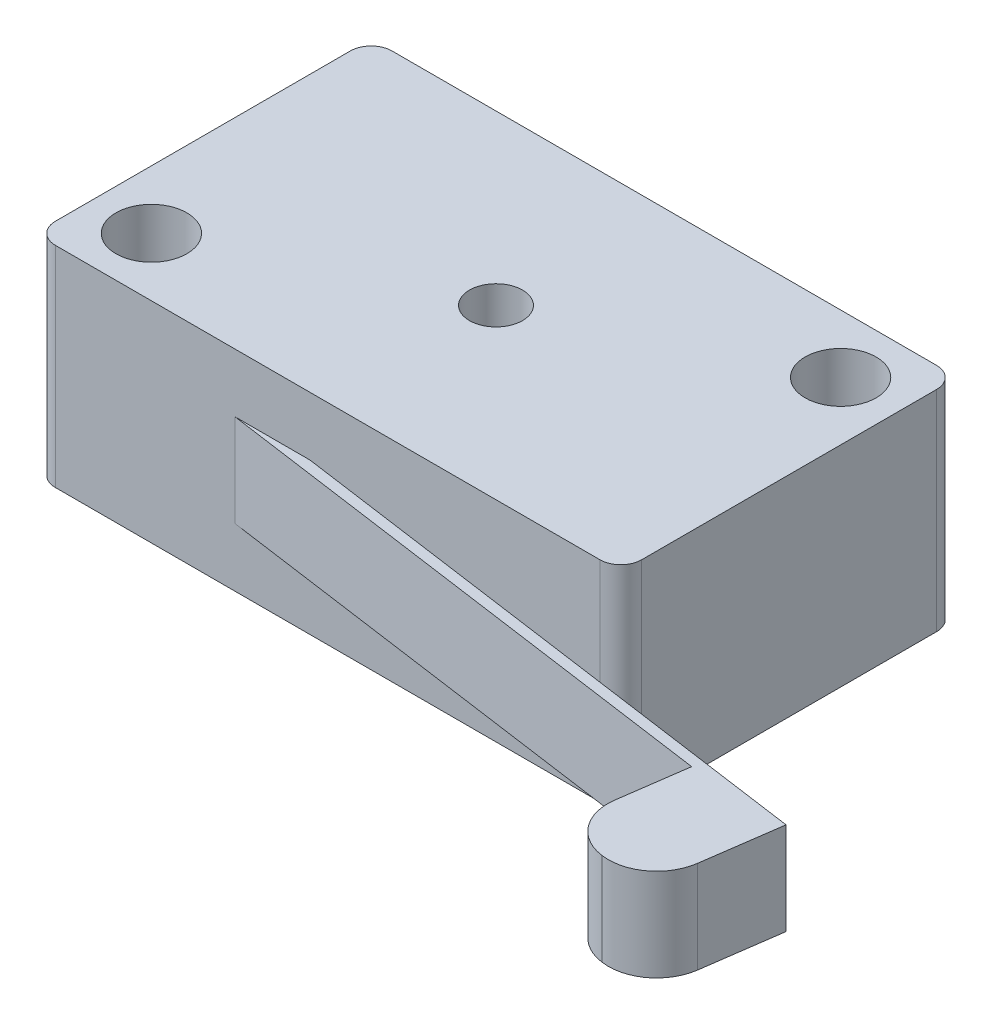
ISO-10303-21;
HEADER;
FILE_DESCRIPTION(('STEP AP214'),'2;1');
FILE_NAME('part.step','',(''),(''),'','','');
FILE_SCHEMA(('AUTOMOTIVE_DESIGN { 1 0 10303 214 1 1 1 1 }'));
ENDSEC;
DATA;
#1=APPLICATION_CONTEXT('core data for automotive mechanical design processes');
#2=APPLICATION_PROTOCOL_DEFINITION('international standard','automotive_design',2000,#1);
#3=PRODUCT_CONTEXT('',#1,'mechanical');
#4=PRODUCT('Part','Part','',(#3));
#5=PRODUCT_RELATED_PRODUCT_CATEGORY('part','',(#4));
#6=PRODUCT_DEFINITION_FORMATION('','',#4);
#7=PRODUCT_DEFINITION_CONTEXT('part definition',#1,'design');
#8=PRODUCT_DEFINITION('design','',#6,#7);
#9=PRODUCT_DEFINITION_SHAPE('','',#8);
#10=(LENGTH_UNIT() NAMED_UNIT(*) SI_UNIT(.MILLI.,.METRE.));
#11=(NAMED_UNIT(*) PLANE_ANGLE_UNIT() SI_UNIT($,.RADIAN.));
#12=(NAMED_UNIT(*) SI_UNIT($,.STERADIAN.) SOLID_ANGLE_UNIT());
#13=UNCERTAINTY_MEASURE_WITH_UNIT(LENGTH_MEASURE(1.E-05),#10,'distance_accuracy_value','');
#14=(GEOMETRIC_REPRESENTATION_CONTEXT(3) GLOBAL_UNCERTAINTY_ASSIGNED_CONTEXT((#13)) GLOBAL_UNIT_ASSIGNED_CONTEXT((#10,
#11,#12)) REPRESENTATION_CONTEXT('',''));
#15=CARTESIAN_POINT('',(0.,0.,0.));
#16=DIRECTION('',(0.,0.,1.));
#17=DIRECTION('',(1.,0.,0.));
#18=AXIS2_PLACEMENT_3D('',#15,#16,#17);
#19=CARTESIAN_POINT('',(25.6220681293941,7.24,12.2901342426241));
#20=DIRECTION('',(0.139173100960065,0.,-0.99026806874157));
#21=DIRECTION('',(-0.99026806874157,0.,-0.139173100960065));
#22=AXIS2_PLACEMENT_3D('',#19,#20,#21);
#23=PLANE('',#22);
#24=DIRECTION('',(0.,-1.,0.));
#25=VECTOR('',#24,1.);
#26=CARTESIAN_POINT('',(21.0173216097458,7.24,11.6429793231598));
#27=LINE('',#26,#25);
#28=CARTESIAN_POINT('',(21.0173216097458,7.24,11.6429793231598));
#29=VERTEX_POINT('',#28);
#30=CARTESIAN_POINT('',(21.0173216097458,2.81,11.6429793231598));
#31=VERTEX_POINT('',#30);
#32=EDGE_CURVE('E149',#29,#31,#27,.T.);
#33=ORIENTED_EDGE('',*,*,#32,.F.);
#34=DIRECTION('',(0.99026806874157,0.,0.139173100960065));
#35=VECTOR('',#34,1.);
#36=CARTESIAN_POINT('',(25.6220681293941,7.24,12.2901342426241));
#37=LINE('',#36,#35);
#38=CARTESIAN_POINT('',(-4.44132413358201,7.24,8.065));
#39=VERTEX_POINT('',#38);
#40=EDGE_CURVE('E159',#39,#29,#37,.T.);
#41=ORIENTED_EDGE('',*,*,#40,.F.);
#42=DIRECTION('',(0.,-1.,0.));
#43=VECTOR('',#42,1.);
#44=CARTESIAN_POINT('',(-4.44132413358201,7.24,8.065));
#45=LINE('',#44,#43);
#46=CARTESIAN_POINT('',(-4.44132413358201,2.81,8.065));
#47=VERTEX_POINT('',#46);
#48=EDGE_CURVE('E168',#39,#47,#45,.T.);
#49=ORIENTED_EDGE('',*,*,#48,.T.);
#50=DIRECTION('',(0.99026806874157,0.,0.139173100960065));
#51=VECTOR('',#50,1.);
#52=CARTESIAN_POINT('',(25.6220681293941,2.81,12.2901342426241));
#53=LINE('',#52,#51);
#54=EDGE_CURVE('E161',#47,#31,#53,.T.);
#55=ORIENTED_EDGE('',*,*,#54,.T.);
#56=EDGE_LOOP('',(#33,#41,#49,#55));
#57=FACE_BOUND('',#56,.T.);
#58=ADVANCED_FACE('F35',(#57),#23,.F.);
#59=CARTESIAN_POINT('',(-14.045,10.05,8.065));
#60=DIRECTION('',(0.,0.,-1.));
#61=DIRECTION('',(-1.,0.,0.));
#62=AXIS2_PLACEMENT_3D('',#59,#60,#61);
#63=PLANE('',#62);
#64=DIRECTION('',(1.,0.,0.));
#65=VECTOR('',#64,1.);
#66=CARTESIAN_POINT('',(-14.045,10.05,8.065));
#67=LINE('',#66,#65);
#68=CARTESIAN_POINT('',(-13.045,10.05,8.065));
#69=VERTEX_POINT('',#68);
#70=CARTESIAN_POINT('',(13.045,10.05,8.065));
#71=VERTEX_POINT('',#70);
#72=EDGE_CURVE('E197',#69,#71,#67,.T.);
#73=ORIENTED_EDGE('',*,*,#72,.F.);
#74=DIRECTION('',(0.,-1.,0.));
#75=VECTOR('',#74,1.);
#76=CARTESIAN_POINT('',(-13.045,10.05,8.065));
#77=LINE('',#76,#75);
#78=CARTESIAN_POINT('',(-13.045,0.,8.065));
#79=VERTEX_POINT('',#78);
#80=EDGE_CURVE('E244',#69,#79,#77,.T.);
#81=ORIENTED_EDGE('',*,*,#80,.T.);
#82=DIRECTION('',(1.,0.,0.));
#83=VECTOR('',#82,1.);
#84=CARTESIAN_POINT('',(-14.045,0.,8.065));
#85=LINE('',#84,#83);
#86=CARTESIAN_POINT('',(13.045,0.,8.065));
#87=VERTEX_POINT('',#86);
#88=EDGE_CURVE('E191',#79,#87,#85,.T.);
#89=ORIENTED_EDGE('',*,*,#88,.T.);
#90=DIRECTION('',(0.,-1.,0.));
#91=VECTOR('',#90,1.);
#92=CARTESIAN_POINT('',(13.045,10.05,8.065));
#93=LINE('',#92,#91);
#94=EDGE_CURVE('E242',#87,#71,#93,.F.);
#95=ORIENTED_EDGE('',*,*,#94,.T.);
#96=EDGE_LOOP('',(#73,#81,#89,#95));
#97=FACE_BOUND('',#96,.T.);
#98=DIRECTION('',(-1.,0.,0.));
#99=VECTOR('',#98,1.);
#100=CARTESIAN_POINT('',(-14.045,7.24,8.065));
#101=LINE('',#100,#99);
#102=CARTESIAN_POINT('',(-0.848675866418178,7.24,8.065));
#103=VERTEX_POINT('',#102);
#104=EDGE_CURVE('E167',#103,#39,#101,.T.);
#105=ORIENTED_EDGE('',*,*,#104,.F.);
#106=DIRECTION('',(0.,1.,0.));
#107=VECTOR('',#106,1.);
#108=CARTESIAN_POINT('',(-0.848675866418144,10.05,8.065));
#109=LINE('',#108,#107);
#110=CARTESIAN_POINT('',(-0.848675866418178,2.81,8.065));
#111=VERTEX_POINT('',#110);
#112=EDGE_CURVE('E213',#111,#103,#109,.T.);
#113=ORIENTED_EDGE('',*,*,#112,.F.);
#114=DIRECTION('',(-1.,0.,0.));
#115=VECTOR('',#114,1.);
#116=CARTESIAN_POINT('',(-14.045,2.81,8.065));
#117=LINE('',#116,#115);
#118=EDGE_CURVE('E200',#111,#47,#117,.T.);
#119=ORIENTED_EDGE('',*,*,#118,.T.);
#120=ORIENTED_EDGE('',*,*,#48,.F.);
#121=EDGE_LOOP('',(#105,#113,#119,#120));
#122=FACE_BOUND('',#121,.T.);
#123=ADVANCED_FACE('F306',(#97,#122),#63,.F.);
#124=CARTESIAN_POINT('',(14.045,10.05,8.065));
#125=DIRECTION('',(-1.,0.,0.));
#126=DIRECTION('',(0.,0.,1.));
#127=AXIS2_PLACEMENT_3D('',#124,#125,#126);
#128=PLANE('',#127);
#129=DIRECTION('',(0.,0.,-1.));
#130=VECTOR('',#129,1.);
#131=CARTESIAN_POINT('',(14.045,0.,8.065));
#132=LINE('',#131,#130);
#133=CARTESIAN_POINT('',(14.045,0.,7.065));
#134=VERTEX_POINT('',#133);
#135=CARTESIAN_POINT('',(14.045,0.,-7.065));
#136=VERTEX_POINT('',#135);
#137=EDGE_CURVE('E186',#134,#136,#132,.T.);
#138=ORIENTED_EDGE('',*,*,#137,.T.);
#139=DIRECTION('',(0.,-1.,0.));
#140=VECTOR('',#139,1.);
#141=CARTESIAN_POINT('',(14.045,10.05,-7.065));
#142=LINE('',#141,#140);
#143=CARTESIAN_POINT('',(14.045,10.05,-7.065));
#144=VERTEX_POINT('',#143);
#145=EDGE_CURVE('E250',#136,#144,#142,.F.);
#146=ORIENTED_EDGE('',*,*,#145,.T.);
#147=DIRECTION('',(0.,0.,-1.));
#148=VECTOR('',#147,1.);
#149=CARTESIAN_POINT('',(14.045,10.05,8.065));
#150=LINE('',#149,#148);
#151=CARTESIAN_POINT('',(14.045,10.05,7.065));
#152=VERTEX_POINT('',#151);
#153=EDGE_CURVE('E187',#152,#144,#150,.T.);
#154=ORIENTED_EDGE('',*,*,#153,.F.);
#155=DIRECTION('',(0.,-1.,0.));
#156=VECTOR('',#155,1.);
#157=CARTESIAN_POINT('',(14.045,10.05,7.065));
#158=LINE('',#157,#156);
#159=EDGE_CURVE('E247',#152,#134,#158,.T.);
#160=ORIENTED_EDGE('',*,*,#159,.T.);
#161=EDGE_LOOP('',(#138,#146,#154,#160));
#162=FACE_BOUND('',#161,.T.);
#163=ADVANCED_FACE('F308',(#162),#128,.F.);
#164=CARTESIAN_POINT('',(-14.045,10.05,-8.065));
#165=DIRECTION('',(0.,0.,1.));
#166=DIRECTION('',(1.,0.,0.));
#167=AXIS2_PLACEMENT_3D('',#164,#165,#166);
#168=PLANE('',#167);
#169=DIRECTION('',(-1.,0.,0.));
#170=VECTOR('',#169,1.);
#171=CARTESIAN_POINT('',(-14.045,0.,-8.065));
#172=LINE('',#171,#170);
#173=CARTESIAN_POINT('',(13.045,0.,-8.065));
#174=VERTEX_POINT('',#173);
#175=CARTESIAN_POINT('',(-13.045,0.,-8.065));
#176=VERTEX_POINT('',#175);
#177=EDGE_CURVE('E203',#174,#176,#172,.T.);
#178=ORIENTED_EDGE('',*,*,#177,.T.);
#179=DIRECTION('',(0.,-1.,0.));
#180=VECTOR('',#179,1.);
#181=CARTESIAN_POINT('',(-13.045,10.05,-8.065));
#182=LINE('',#181,#180);
#183=CARTESIAN_POINT('',(-13.045,10.05,-8.065));
#184=VERTEX_POINT('',#183);
#185=EDGE_CURVE('E232',#176,#184,#182,.F.);
#186=ORIENTED_EDGE('',*,*,#185,.T.);
#187=DIRECTION('',(-1.,0.,0.));
#188=VECTOR('',#187,1.);
#189=CARTESIAN_POINT('',(-14.045,10.05,-8.065));
#190=LINE('',#189,#188);
#191=CARTESIAN_POINT('',(13.045,10.05,-8.065));
#192=VERTEX_POINT('',#191);
#193=EDGE_CURVE('E190',#192,#184,#190,.T.);
#194=ORIENTED_EDGE('',*,*,#193,.F.);
#195=DIRECTION('',(0.,-1.,0.));
#196=VECTOR('',#195,1.);
#197=CARTESIAN_POINT('',(13.045,10.05,-8.065));
#198=LINE('',#197,#196);
#199=EDGE_CURVE('E229',#192,#174,#198,.T.);
#200=ORIENTED_EDGE('',*,*,#199,.T.);
#201=EDGE_LOOP('',(#178,#186,#194,#200));
#202=FACE_BOUND('',#201,.T.);
#203=ADVANCED_FACE('F315',(#202),#168,.F.);
#204=CARTESIAN_POINT('',(-14.045,10.05,8.065));
#205=DIRECTION('',(1.,0.,0.));
#206=DIRECTION('',(0.,0.,-1.));
#207=AXIS2_PLACEMENT_3D('',#204,#205,#206);
#208=PLANE('',#207);
#209=DIRECTION('',(0.,0.,1.));
#210=VECTOR('',#209,1.);
#211=CARTESIAN_POINT('',(-14.045,10.05,8.065));
#212=LINE('',#211,#210);
#213=CARTESIAN_POINT('',(-14.045,10.05,-7.065));
#214=VERTEX_POINT('',#213);
#215=CARTESIAN_POINT('',(-14.045,10.05,7.065));
#216=VERTEX_POINT('',#215);
#217=EDGE_CURVE('E194',#214,#216,#212,.T.);
#218=ORIENTED_EDGE('',*,*,#217,.F.);
#219=DIRECTION('',(0.,-1.,0.));
#220=VECTOR('',#219,1.);
#221=CARTESIAN_POINT('',(-14.045,10.05,-7.065));
#222=LINE('',#221,#220);
#223=CARTESIAN_POINT('',(-14.045,0.,-7.065));
#224=VERTEX_POINT('',#223);
#225=EDGE_CURVE('E218',#214,#224,#222,.T.);
#226=ORIENTED_EDGE('',*,*,#225,.T.);
#227=DIRECTION('',(0.,0.,1.));
#228=VECTOR('',#227,1.);
#229=CARTESIAN_POINT('',(-14.045,0.,8.065));
#230=LINE('',#229,#228);
#231=CARTESIAN_POINT('',(-14.045,0.,7.065));
#232=VERTEX_POINT('',#231);
#233=EDGE_CURVE('E206',#224,#232,#230,.T.);
#234=ORIENTED_EDGE('',*,*,#233,.T.);
#235=DIRECTION('',(0.,-1.,0.));
#236=VECTOR('',#235,1.);
#237=CARTESIAN_POINT('',(-14.045,10.05,7.065));
#238=LINE('',#237,#236);
#239=EDGE_CURVE('E216',#232,#216,#238,.F.);
#240=ORIENTED_EDGE('',*,*,#239,.T.);
#241=EDGE_LOOP('',(#218,#226,#234,#240));
#242=FACE_BOUND('',#241,.T.);
#243=ADVANCED_FACE('F324',(#242),#208,.F.);
#244=CARTESIAN_POINT('',(0.,10.05,0.));
#245=DIRECTION('',(0.,-1.,0.));
#246=DIRECTION('',(0.,0.,-1.));
#247=AXIS2_PLACEMENT_3D('',#244,#245,#246);
#248=PLANE('',#247);
#249=CARTESIAN_POINT('',(-11.245,10.05,5.265));
#250=DIRECTION('',(0.,1.,0.));
#251=DIRECTION('',(0.,0.,1.));
#252=AXIS2_PLACEMENT_3D('',#249,#250,#251);
#253=CIRCLE('',#252,1.7);
#254=CARTESIAN_POINT('',(-11.245,10.05,6.965));
#255=VERTEX_POINT('',#254);
#256=EDGE_CURVE('E279',#255,#255,#253,.T.);
#257=ORIENTED_EDGE('',*,*,#256,.F.);
#258=EDGE_LOOP('',(#257));
#259=FACE_BOUND('',#258,.T.);
#260=CARTESIAN_POINT('',(0.,10.05,0.));
#261=DIRECTION('',(0.,1.,0.));
#262=DIRECTION('',(0.,0.,1.));
#263=AXIS2_PLACEMENT_3D('',#260,#261,#262);
#264=CIRCLE('',#263,1.27);
#265=CARTESIAN_POINT('',(0.,10.05,1.27));
#266=VERTEX_POINT('',#265);
#267=EDGE_CURVE('E153',#266,#266,#264,.T.);
#268=ORIENTED_EDGE('',*,*,#267,.F.);
#269=EDGE_LOOP('',(#268));
#270=FACE_BOUND('',#269,.T.);
#271=CARTESIAN_POINT('',(11.245,10.05,-5.265));
#272=DIRECTION('',(0.,1.,0.));
#273=DIRECTION('',(0.,0.,1.));
#274=AXIS2_PLACEMENT_3D('',#271,#272,#273);
#275=CIRCLE('',#274,1.7);
#276=CARTESIAN_POINT('',(11.245,10.05,-3.565));
#277=VERTEX_POINT('',#276);
#278=EDGE_CURVE('E286',#277,#277,#275,.T.);
#279=ORIENTED_EDGE('',*,*,#278,.F.);
#280=EDGE_LOOP('',(#279));
#281=FACE_BOUND('',#280,.T.);
#282=ORIENTED_EDGE('',*,*,#193,.T.);
#283=CARTESIAN_POINT('',(-13.045,10.05,-7.065));
#284=DIRECTION('',(0.,-1.,0.));
#285=DIRECTION('',(0.,0.,-1.));
#286=AXIS2_PLACEMENT_3D('',#283,#284,#285);
#287=CIRCLE('',#286,1.);
#288=EDGE_CURVE('E240',#184,#214,#287,.F.);
#289=ORIENTED_EDGE('',*,*,#288,.T.);
#290=ORIENTED_EDGE('',*,*,#217,.T.);
#291=CARTESIAN_POINT('',(-13.045,10.05,7.065));
#292=DIRECTION('',(0.,-1.,0.));
#293=DIRECTION('',(0.,0.,-1.));
#294=AXIS2_PLACEMENT_3D('',#291,#292,#293);
#295=CIRCLE('',#294,1.);
#296=EDGE_CURVE('E238',#216,#69,#295,.F.);
#297=ORIENTED_EDGE('',*,*,#296,.T.);
#298=ORIENTED_EDGE('',*,*,#72,.T.);
#299=CARTESIAN_POINT('',(13.045,10.05,7.065));
#300=DIRECTION('',(0.,-1.,0.));
#301=DIRECTION('',(0.,0.,-1.));
#302=AXIS2_PLACEMENT_3D('',#299,#300,#301);
#303=CIRCLE('',#302,1.);
#304=EDGE_CURVE('E234',#71,#152,#303,.F.);
#305=ORIENTED_EDGE('',*,*,#304,.T.);
#306=ORIENTED_EDGE('',*,*,#153,.T.);
#307=CARTESIAN_POINT('',(13.045,10.05,-7.065));
#308=DIRECTION('',(0.,-1.,0.));
#309=DIRECTION('',(0.,0.,-1.));
#310=AXIS2_PLACEMENT_3D('',#307,#308,#309);
#311=CIRCLE('',#310,1.);
#312=EDGE_CURVE('E236',#144,#192,#311,.F.);
#313=ORIENTED_EDGE('',*,*,#312,.T.);
#314=EDGE_LOOP('',(#282,#289,#290,#297,#298,#305,#306,#313));
#315=FACE_BOUND('',#314,.T.);
#316=ADVANCED_FACE('F327',(#259,#270,#281,#315),#248,.F.);
#317=CARTESIAN_POINT('',(0.,0.,0.));
#318=DIRECTION('',(0.,-1.,0.));
#319=DIRECTION('',(0.,0.,-1.));
#320=AXIS2_PLACEMENT_3D('',#317,#318,#319);
#321=PLANE('',#320);
#322=CARTESIAN_POINT('',(-11.245,0.,5.265));
#323=DIRECTION('',(0.,1.,0.));
#324=DIRECTION('',(0.,0.,1.));
#325=AXIS2_PLACEMENT_3D('',#322,#323,#324);
#326=CIRCLE('',#325,1.7);
#327=CARTESIAN_POINT('',(-11.245,0.,6.965));
#328=VERTEX_POINT('',#327);
#329=EDGE_CURVE('E282',#328,#328,#326,.T.);
#330=ORIENTED_EDGE('',*,*,#329,.T.);
#331=EDGE_LOOP('',(#330));
#332=FACE_BOUND('',#331,.T.);
#333=CARTESIAN_POINT('',(0.,0.,0.));
#334=DIRECTION('',(0.,1.,0.));
#335=DIRECTION('',(0.,0.,1.));
#336=AXIS2_PLACEMENT_3D('',#333,#334,#335);
#337=CIRCLE('',#336,1.27);
#338=CARTESIAN_POINT('',(0.,0.,1.27));
#339=VERTEX_POINT('',#338);
#340=EDGE_CURVE('E283',#339,#339,#337,.T.);
#341=ORIENTED_EDGE('',*,*,#340,.T.);
#342=EDGE_LOOP('',(#341));
#343=FACE_BOUND('',#342,.T.);
#344=CARTESIAN_POINT('',(11.245,0.,-5.265));
#345=DIRECTION('',(0.,1.,0.));
#346=DIRECTION('',(0.,0.,1.));
#347=AXIS2_PLACEMENT_3D('',#344,#345,#346);
#348=CIRCLE('',#347,1.7);
#349=CARTESIAN_POINT('',(11.245,0.,-3.565));
#350=VERTEX_POINT('',#349);
#351=EDGE_CURVE('E180',#350,#350,#348,.T.);
#352=ORIENTED_EDGE('',*,*,#351,.T.);
#353=EDGE_LOOP('',(#352));
#354=FACE_BOUND('',#353,.T.);
#355=ORIENTED_EDGE('',*,*,#233,.F.);
#356=CARTESIAN_POINT('',(-13.045,0.,-7.065));
#357=DIRECTION('',(0.,-1.,0.));
#358=DIRECTION('',(0.,0.,-1.));
#359=AXIS2_PLACEMENT_3D('',#356,#357,#358);
#360=CIRCLE('',#359,1.);
#361=EDGE_CURVE('E227',#224,#176,#360,.T.);
#362=ORIENTED_EDGE('',*,*,#361,.T.);
#363=ORIENTED_EDGE('',*,*,#177,.F.);
#364=CARTESIAN_POINT('',(13.045,0.,-7.065));
#365=DIRECTION('',(0.,-1.,0.));
#366=DIRECTION('',(0.,0.,-1.));
#367=AXIS2_PLACEMENT_3D('',#364,#365,#366);
#368=CIRCLE('',#367,1.);
#369=EDGE_CURVE('E223',#174,#136,#368,.T.);
#370=ORIENTED_EDGE('',*,*,#369,.T.);
#371=ORIENTED_EDGE('',*,*,#137,.F.);
#372=CARTESIAN_POINT('',(13.045,0.,7.065));
#373=DIRECTION('',(0.,-1.,0.));
#374=DIRECTION('',(0.,0.,-1.));
#375=AXIS2_PLACEMENT_3D('',#372,#373,#374);
#376=CIRCLE('',#375,1.);
#377=EDGE_CURVE('E221',#134,#87,#376,.T.);
#378=ORIENTED_EDGE('',*,*,#377,.T.);
#379=ORIENTED_EDGE('',*,*,#88,.F.);
#380=CARTESIAN_POINT('',(-13.045,0.,7.065));
#381=DIRECTION('',(0.,-1.,0.));
#382=DIRECTION('',(0.,0.,-1.));
#383=AXIS2_PLACEMENT_3D('',#380,#381,#382);
#384=CIRCLE('',#383,1.);
#385=EDGE_CURVE('E225',#79,#232,#384,.T.);
#386=ORIENTED_EDGE('',*,*,#385,.T.);
#387=EDGE_LOOP('',(#355,#362,#363,#370,#371,#378,#379,#386));
#388=FACE_BOUND('',#387,.T.);
#389=ADVANCED_FACE('F322',(#332,#343,#354,#388),#321,.T.);
#390=CARTESIAN_POINT('',(-4.37173758310197,7.24,7.56986596562921));
#391=DIRECTION('',(-0.139173100960065,0.,0.99026806874157));
#392=DIRECTION('',(0.99026806874157,0.,0.139173100960065));
#393=AXIS2_PLACEMENT_3D('',#390,#391,#392);
#394=PLANE('',#393);
#395=DIRECTION('',(-0.99026806874157,0.,-0.139173100960065));
#396=VECTOR('',#395,1.);
#397=CARTESIAN_POINT('',(-4.37173758310197,2.81,7.56986596562921));
#398=LINE('',#397,#396);
#399=CARTESIAN_POINT('',(25.6916546798741,2.81,11.7950002082533));
#400=VERTEX_POINT('',#399);
#401=EDGE_CURVE('E177',#400,#111,#398,.T.);
#402=ORIENTED_EDGE('',*,*,#401,.T.);
#403=ORIENTED_EDGE('',*,*,#112,.T.);
#404=DIRECTION('',(-0.99026806874157,0.,-0.139173100960065));
#405=VECTOR('',#404,1.);
#406=CARTESIAN_POINT('',(-4.37173758310197,7.24,7.56986596562921));
#407=LINE('',#406,#405);
#408=CARTESIAN_POINT('',(25.6916546798741,7.24,11.7950002082533));
#409=VERTEX_POINT('',#408);
#410=EDGE_CURVE('E169',#409,#103,#407,.T.);
#411=ORIENTED_EDGE('',*,*,#410,.F.);
#412=DIRECTION('',(0.,-1.,0.));
#413=VECTOR('',#412,1.);
#414=CARTESIAN_POINT('',(25.6916546798741,7.24,11.7950002082533));
#415=LINE('',#414,#413);
#416=EDGE_CURVE('E171',#409,#400,#415,.T.);
#417=ORIENTED_EDGE('',*,*,#416,.T.);
#418=EDGE_LOOP('',(#402,#403,#411,#417));
#419=FACE_BOUND('',#418,.T.);
#420=ADVANCED_FACE('F299',(#419),#394,.F.);
#421=CARTESIAN_POINT('',(0.,7.24,0.));
#422=DIRECTION('',(0.,-1.,0.));
#423=DIRECTION('',(0.,0.,-1.));
#424=AXIS2_PLACEMENT_3D('',#421,#422,#423);
#425=PLANE('',#424);
#426=DIRECTION('',(0.139173100960065,0.,-0.99026806874157));
#427=VECTOR('',#426,1.);
#428=CARTESIAN_POINT('',(20.2435191684078,7.24,17.1488697853629));
#429=LINE('',#428,#427);
#430=CARTESIAN_POINT('',(20.5636173006159,7.24,14.8712532272573));
#431=VERTEX_POINT('',#430);
#432=EDGE_CURVE('E146',#431,#29,#429,.T.);
#433=ORIENTED_EDGE('',*,*,#432,.F.);
#434=CARTESIAN_POINT('',(22.8412338587216,7.24,15.1913513594654));
#435=DIRECTION('',(0.,-1.,0.));
#436=DIRECTION('',(0.,0.,-1.));
#437=AXIS2_PLACEMENT_3D('',#434,#435,#436);
#438=CIRCLE('',#437,2.3);
#439=CARTESIAN_POINT('',(22.5211357265134,7.24,17.468967917571));
#440=VERTEX_POINT('',#439);
#441=EDGE_CURVE('E43',#431,#440,#438,.F.);
#442=ORIENTED_EDGE('',*,*,#441,.T.);
#443=DIRECTION('',(-0.99026806874157,0.,-0.139173100960065));
#444=VECTOR('',#443,1.);
#445=CARTESIAN_POINT('',(24.8482656880561,7.24,17.7960247048272));
#446=LINE('',#445,#444);
#447=CARTESIAN_POINT('',(22.5706491299505,7.24,17.475926572619));
#448=VERTEX_POINT('',#447);
#449=EDGE_CURVE('E162',#448,#440,#446,.T.);
#450=ORIENTED_EDGE('',*,*,#449,.F.);
#451=CARTESIAN_POINT('',(22.8907472621586,7.24,15.1983100145134));
#452=DIRECTION('',(0.,-1.,0.));
#453=DIRECTION('',(0.,0.,-1.));
#454=AXIS2_PLACEMENT_3D('',#451,#452,#453);
#455=CIRCLE('',#454,2.3);
#456=CARTESIAN_POINT('',(25.1683638202643,7.24,15.5184081467216));
#457=VERTEX_POINT('',#456);
#458=EDGE_CURVE('E50',#448,#457,#455,.F.);
#459=ORIENTED_EDGE('',*,*,#458,.T.);
#460=DIRECTION('',(0.139173100960038,0.,-0.990268068741574));
#461=VECTOR('',#460,1.);
#462=CARTESIAN_POINT('',(25.6916546798741,7.24,11.7950002082533));
#463=LINE('',#462,#461);
#464=EDGE_CURVE('E173',#457,#409,#463,.T.);
#465=ORIENTED_EDGE('',*,*,#464,.T.);
#466=ORIENTED_EDGE('',*,*,#410,.T.);
#467=ORIENTED_EDGE('',*,*,#104,.T.);
#468=ORIENTED_EDGE('',*,*,#40,.T.);
#469=EDGE_LOOP('',(#433,#442,#450,#459,#465,#466,#467,#468));
#470=FACE_BOUND('',#469,.T.);
#471=ADVANCED_FACE('F164',(#470),#425,.F.);
#472=CARTESIAN_POINT('',(0.,2.81,0.));
#473=DIRECTION('',(0.,-1.,0.));
#474=DIRECTION('',(0.,0.,-1.));
#475=AXIS2_PLACEMENT_3D('',#472,#473,#474);
#476=PLANE('',#475);
#477=DIRECTION('',(0.99026806874157,0.,0.139173100960065));
#478=VECTOR('',#477,1.);
#479=CARTESIAN_POINT('',(24.8482656880561,2.81,17.7960247048272));
#480=LINE('',#479,#478);
#481=CARTESIAN_POINT('',(22.5211357265134,2.81,17.468967917571));
#482=VERTEX_POINT('',#481);
#483=CARTESIAN_POINT('',(22.5706491299505,2.81,17.475926572619));
#484=VERTEX_POINT('',#483);
#485=EDGE_CURVE('E271',#482,#484,#480,.T.);
#486=ORIENTED_EDGE('',*,*,#485,.F.);
#487=CARTESIAN_POINT('',(22.8412338587216,2.81,15.1913513594654));
#488=DIRECTION('',(0.,-1.,0.));
#489=DIRECTION('',(0.,0.,-1.));
#490=AXIS2_PLACEMENT_3D('',#487,#488,#489);
#491=CIRCLE('',#490,2.3);
#492=CARTESIAN_POINT('',(20.5636173006159,2.81,14.8712532272573));
#493=VERTEX_POINT('',#492);
#494=EDGE_CURVE('E260',#482,#493,#491,.T.);
#495=ORIENTED_EDGE('',*,*,#494,.T.);
#496=DIRECTION('',(0.139173100960065,0.,-0.99026806874157));
#497=VECTOR('',#496,1.);
#498=CARTESIAN_POINT('',(20.2435191684078,2.81,17.1488697853629));
#499=LINE('',#498,#497);
#500=EDGE_CURVE('E154',#493,#31,#499,.T.);
#501=ORIENTED_EDGE('',*,*,#500,.T.);
#502=ORIENTED_EDGE('',*,*,#54,.F.);
#503=ORIENTED_EDGE('',*,*,#118,.F.);
#504=ORIENTED_EDGE('',*,*,#401,.F.);
#505=DIRECTION('',(0.139173100960067,0.,-0.99026806874157));
#506=VECTOR('',#505,1.);
#507=CARTESIAN_POINT('',(25.6568614046341,2.81,12.0425672254387));
#508=LINE('',#507,#506);
#509=CARTESIAN_POINT('',(25.1683638202642,2.81,15.5184081467216));
#510=VERTEX_POINT('',#509);
#511=EDGE_CURVE('E182',#510,#400,#508,.T.);
#512=ORIENTED_EDGE('',*,*,#511,.F.);
#513=CARTESIAN_POINT('',(22.8907472621586,2.81,15.1983100145134));
#514=DIRECTION('',(0.,-1.,0.));
#515=DIRECTION('',(0.,0.,-1.));
#516=AXIS2_PLACEMENT_3D('',#513,#514,#515);
#517=CIRCLE('',#516,2.3);
#518=EDGE_CURVE('E258',#510,#484,#517,.T.);
#519=ORIENTED_EDGE('',*,*,#518,.T.);
#520=EDGE_LOOP('',(#486,#495,#501,#502,#503,#504,#512,#519));
#521=FACE_BOUND('',#520,.T.);
#522=ADVANCED_FACE('F275',(#521),#476,.T.);
#523=CARTESIAN_POINT('',(25.6568614046341,7.24,12.0425672254387));
#524=DIRECTION('',(-0.99026806874157,0.,-0.139173100960067));
#525=DIRECTION('',(-0.139173100960067,0.,0.99026806874157));
#526=AXIS2_PLACEMENT_3D('',#523,#524,#525);
#527=PLANE('',#526);
#528=ORIENTED_EDGE('',*,*,#464,.F.);
#529=DIRECTION('',(0.,1.,0.));
#530=VECTOR('',#529,1.);
#531=CARTESIAN_POINT('',(25.1683638202642,7.24,15.5184081467216));
#532=LINE('',#531,#530);
#533=EDGE_CURVE('E11',#457,#510,#532,.F.);
#534=ORIENTED_EDGE('',*,*,#533,.T.);
#535=ORIENTED_EDGE('',*,*,#511,.T.);
#536=ORIENTED_EDGE('',*,*,#416,.F.);
#537=EDGE_LOOP('',(#528,#534,#535,#536));
#538=FACE_BOUND('',#537,.T.);
#539=ADVANCED_FACE('F301',(#538),#527,.F.);
#540=CARTESIAN_POINT('',(-13.045,10.05,-7.065));
#541=DIRECTION('',(0.,-1.,0.));
#542=DIRECTION('',(0.,0.,-1.));
#543=AXIS2_PLACEMENT_3D('',#540,#541,#542);
#544=CYLINDRICAL_SURFACE('',#543,1.);
#545=ORIENTED_EDGE('',*,*,#288,.F.);
#546=ORIENTED_EDGE('',*,*,#185,.F.);
#547=ORIENTED_EDGE('',*,*,#361,.F.);
#548=ORIENTED_EDGE('',*,*,#225,.F.);
#549=EDGE_LOOP('',(#545,#546,#547,#548));
#550=FACE_BOUND('',#549,.T.);
#551=ADVANCED_FACE('F332',(#550),#544,.T.);
#552=CARTESIAN_POINT('',(-13.045,10.05,7.065));
#553=DIRECTION('',(0.,-1.,0.));
#554=DIRECTION('',(0.,0.,-1.));
#555=AXIS2_PLACEMENT_3D('',#552,#553,#554);
#556=CYLINDRICAL_SURFACE('',#555,1.);
#557=ORIENTED_EDGE('',*,*,#296,.F.);
#558=ORIENTED_EDGE('',*,*,#239,.F.);
#559=ORIENTED_EDGE('',*,*,#385,.F.);
#560=ORIENTED_EDGE('',*,*,#80,.F.);
#561=EDGE_LOOP('',(#557,#558,#559,#560));
#562=FACE_BOUND('',#561,.T.);
#563=ADVANCED_FACE('F335',(#562),#556,.T.);
#564=CARTESIAN_POINT('',(13.045,10.05,-7.065));
#565=DIRECTION('',(0.,-1.,0.));
#566=DIRECTION('',(0.,0.,-1.));
#567=AXIS2_PLACEMENT_3D('',#564,#565,#566);
#568=CYLINDRICAL_SURFACE('',#567,1.);
#569=ORIENTED_EDGE('',*,*,#312,.F.);
#570=ORIENTED_EDGE('',*,*,#145,.F.);
#571=ORIENTED_EDGE('',*,*,#369,.F.);
#572=ORIENTED_EDGE('',*,*,#199,.F.);
#573=EDGE_LOOP('',(#569,#570,#571,#572));
#574=FACE_BOUND('',#573,.T.);
#575=ADVANCED_FACE('F339',(#574),#568,.T.);
#576=CARTESIAN_POINT('',(13.045,10.05,7.065));
#577=DIRECTION('',(0.,-1.,0.));
#578=DIRECTION('',(0.,0.,-1.));
#579=AXIS2_PLACEMENT_3D('',#576,#577,#578);
#580=CYLINDRICAL_SURFACE('',#579,1.);
#581=ORIENTED_EDGE('',*,*,#304,.F.);
#582=ORIENTED_EDGE('',*,*,#94,.F.);
#583=ORIENTED_EDGE('',*,*,#377,.F.);
#584=ORIENTED_EDGE('',*,*,#159,.F.);
#585=EDGE_LOOP('',(#581,#582,#583,#584));
#586=FACE_BOUND('',#585,.T.);
#587=ADVANCED_FACE('F343',(#586),#580,.T.);
#588=CARTESIAN_POINT('',(11.245,0.,-5.265));
#589=DIRECTION('',(0.,1.,0.));
#590=DIRECTION('',(0.,0.,1.));
#591=AXIS2_PLACEMENT_3D('',#588,#589,#590);
#592=CYLINDRICAL_SURFACE('',#591,1.7);
#593=ORIENTED_EDGE('',*,*,#351,.F.);
#594=EDGE_LOOP('',(#593));
#595=FACE_BOUND('',#594,.T.);
#596=ORIENTED_EDGE('',*,*,#278,.T.);
#597=EDGE_LOOP('',(#596));
#598=FACE_BOUND('',#597,.T.);
#599=ADVANCED_FACE('F346',(#595,#598),#592,.F.);
#600=CARTESIAN_POINT('',(0.,0.,0.));
#601=DIRECTION('',(0.,1.,0.));
#602=DIRECTION('',(0.,0.,1.));
#603=AXIS2_PLACEMENT_3D('',#600,#601,#602);
#604=CYLINDRICAL_SURFACE('',#603,1.27);
#605=ORIENTED_EDGE('',*,*,#340,.F.);
#606=EDGE_LOOP('',(#605));
#607=FACE_BOUND('',#606,.T.);
#608=ORIENTED_EDGE('',*,*,#267,.T.);
#609=EDGE_LOOP('',(#608));
#610=FACE_BOUND('',#609,.T.);
#611=ADVANCED_FACE('F363',(#607,#610),#604,.F.);
#612=CARTESIAN_POINT('',(-11.245,0.,5.265));
#613=DIRECTION('',(0.,1.,0.));
#614=DIRECTION('',(0.,0.,1.));
#615=AXIS2_PLACEMENT_3D('',#612,#613,#614);
#616=CYLINDRICAL_SURFACE('',#615,1.7);
#617=ORIENTED_EDGE('',*,*,#329,.F.);
#618=EDGE_LOOP('',(#617));
#619=FACE_BOUND('',#618,.T.);
#620=ORIENTED_EDGE('',*,*,#256,.T.);
#621=EDGE_LOOP('',(#620));
#622=FACE_BOUND('',#621,.T.);
#623=ADVANCED_FACE('F358',(#619,#622),#616,.F.);
#624=CARTESIAN_POINT('',(20.2435191684078,7.24,17.1488697853629));
#625=DIRECTION('',(0.99026806874157,0.,0.139173100960065));
#626=DIRECTION('',(0.139173100960065,0.,-0.99026806874157));
#627=AXIS2_PLACEMENT_3D('',#624,#625,#626);
#628=PLANE('',#627);
#629=ORIENTED_EDGE('',*,*,#500,.F.);
#630=DIRECTION('',(0.,-1.,0.));
#631=VECTOR('',#630,1.);
#632=CARTESIAN_POINT('',(20.5636173006159,7.24,14.8712532272573));
#633=LINE('',#632,#631);
#634=EDGE_CURVE('E58',#493,#431,#633,.F.);
#635=ORIENTED_EDGE('',*,*,#634,.T.);
#636=ORIENTED_EDGE('',*,*,#432,.T.);
#637=ORIENTED_EDGE('',*,*,#32,.T.);
#638=EDGE_LOOP('',(#629,#635,#636,#637));
#639=FACE_BOUND('',#638,.T.);
#640=ADVANCED_FACE('F148',(#639),#628,.F.);
#641=CARTESIAN_POINT('',(-1.9713347610316,0.,14.0267756713278));
#642=DIRECTION('',(0.139173100960065,0.,-0.99026806874157));
#643=DIRECTION('',(-0.99026806874157,0.,-0.139173100960065));
#644=AXIS2_PLACEMENT_3D('',#641,#642,#643);
#645=PLANE('',#644);
#646=ORIENTED_EDGE('',*,*,#449,.T.);
#647=DIRECTION('',(0.,-1.,0.));
#648=VECTOR('',#647,1.);
#649=CARTESIAN_POINT('',(22.5211357265134,0.,17.468967917571));
#650=LINE('',#649,#648);
#651=EDGE_CURVE('E255',#440,#482,#650,.T.);
#652=ORIENTED_EDGE('',*,*,#651,.T.);
#653=ORIENTED_EDGE('',*,*,#485,.T.);
#654=DIRECTION('',(0.,1.,0.));
#655=VECTOR('',#654,1.);
#656=CARTESIAN_POINT('',(22.5706491299505,0.,17.475926572619));
#657=LINE('',#656,#655);
#658=EDGE_CURVE('E252',#484,#448,#657,.T.);
#659=ORIENTED_EDGE('',*,*,#658,.T.);
#660=EDGE_LOOP('',(#646,#652,#653,#659));
#661=FACE_BOUND('',#660,.T.);
#662=ADVANCED_FACE('F267',(#661),#645,.F.);
#663=CARTESIAN_POINT('',(22.8412338587216,0.,15.1913513594654));
#664=DIRECTION('',(0.,-1.,0.));
#665=DIRECTION('',(0.,0.,-1.));
#666=AXIS2_PLACEMENT_3D('',#663,#664,#665);
#667=CYLINDRICAL_SURFACE('',#666,2.3);
#668=ORIENTED_EDGE('',*,*,#441,.F.);
#669=ORIENTED_EDGE('',*,*,#634,.F.);
#670=ORIENTED_EDGE('',*,*,#494,.F.);
#671=ORIENTED_EDGE('',*,*,#651,.F.);
#672=EDGE_LOOP('',(#668,#669,#670,#671));
#673=FACE_BOUND('',#672,.T.);
#674=ADVANCED_FACE('F273',(#673),#667,.T.);
#675=CARTESIAN_POINT('',(22.8907472621586,0.,15.1983100145134));
#676=DIRECTION('',(0.,1.,0.));
#677=DIRECTION('',(0.,0.,1.));
#678=AXIS2_PLACEMENT_3D('',#675,#676,#677);
#679=CYLINDRICAL_SURFACE('',#678,2.3);
#680=ORIENTED_EDGE('',*,*,#518,.F.);
#681=ORIENTED_EDGE('',*,*,#533,.F.);
#682=ORIENTED_EDGE('',*,*,#458,.F.);
#683=ORIENTED_EDGE('',*,*,#658,.F.);
#684=EDGE_LOOP('',(#680,#681,#682,#683));
#685=FACE_BOUND('',#684,.T.);
#686=ADVANCED_FACE('F37',(#685),#679,.T.);
#687=CLOSED_SHELL('',(#58,#123,#163,#203,#243,#316,#389,#420,#471,#522,#539,#551,#563,#575,#587,
#599,#611,#623,#640,#662,#674,#686));
#688=MANIFOLD_SOLID_BREP('B2',#687);
#689=ADVANCED_BREP_SHAPE_REPRESENTATION('',(#18,#688),#14);
#690=SHAPE_DEFINITION_REPRESENTATION(#9,#689);
ENDSEC;
END-ISO-10303-21;
